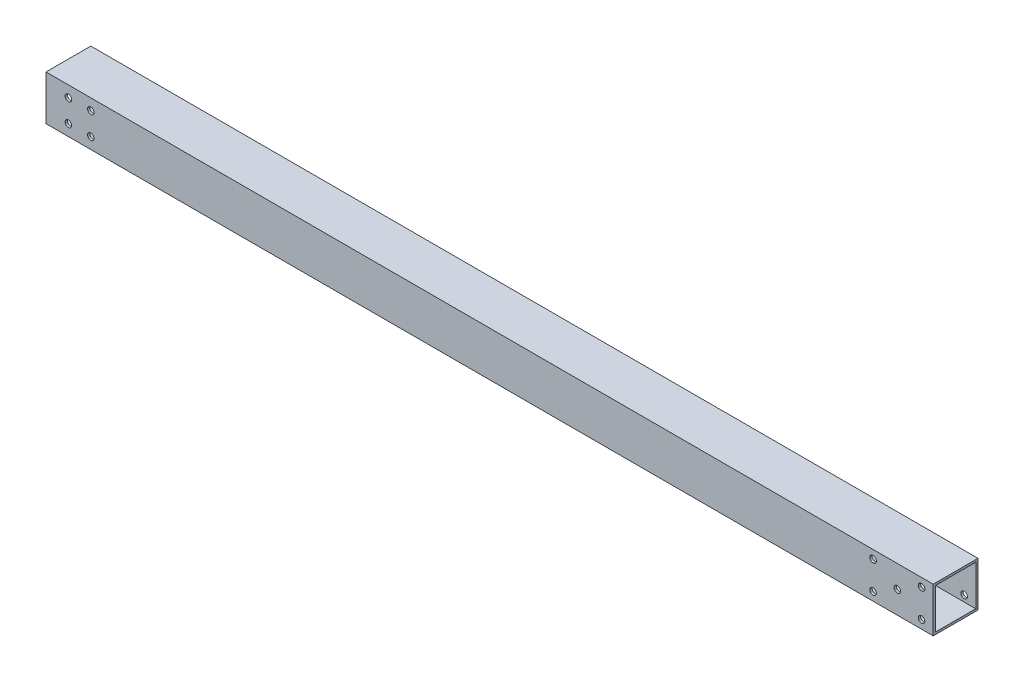
ISO-10303-21;
HEADER;
FILE_DESCRIPTION(('STEP AP214'),'2;1');
FILE_NAME('part.step','',(''),(''),'','','');
FILE_SCHEMA(('AUTOMOTIVE_DESIGN { 1 0 10303 214 1 1 1 1 }'));
ENDSEC;
DATA;
#1=APPLICATION_CONTEXT('core data for automotive mechanical design processes');
#2=APPLICATION_PROTOCOL_DEFINITION('international standard','automotive_design',2000,#1);
#3=PRODUCT_CONTEXT('',#1,'mechanical');
#4=PRODUCT('Part','Part','',(#3));
#5=PRODUCT_RELATED_PRODUCT_CATEGORY('part','',(#4));
#6=PRODUCT_DEFINITION_FORMATION('','',#4);
#7=PRODUCT_DEFINITION_CONTEXT('part definition',#1,'design');
#8=PRODUCT_DEFINITION('design','',#6,#7);
#9=PRODUCT_DEFINITION_SHAPE('','',#8);
#10=(LENGTH_UNIT() NAMED_UNIT(*) SI_UNIT(.MILLI.,.METRE.));
#11=(NAMED_UNIT(*) PLANE_ANGLE_UNIT() SI_UNIT($,.RADIAN.));
#12=(NAMED_UNIT(*) SI_UNIT($,.STERADIAN.) SOLID_ANGLE_UNIT());
#13=UNCERTAINTY_MEASURE_WITH_UNIT(LENGTH_MEASURE(1.E-05),#10,'distance_accuracy_value','');
#14=(GEOMETRIC_REPRESENTATION_CONTEXT(3) GLOBAL_UNCERTAINTY_ASSIGNED_CONTEXT((#13)) GLOBAL_UNIT_ASSIGNED_CONTEXT((#10,
#11,#12)) REPRESENTATION_CONTEXT('',''));
#15=CARTESIAN_POINT('',(0.,0.,0.));
#16=DIRECTION('',(0.,0.,1.));
#17=DIRECTION('',(1.,0.,0.));
#18=AXIS2_PLACEMENT_3D('',#15,#16,#17);
#19=CARTESIAN_POINT('',(396.,0.,0.));
#20=DIRECTION('',(1.,0.,0.));
#21=DIRECTION('',(0.,0.,-1.));
#22=AXIS2_PLACEMENT_3D('',#19,#20,#21);
#23=PLANE('',#22);
#24=DIRECTION('',(0.,1.,0.));
#25=VECTOR('',#24,1.);
#26=CARTESIAN_POINT('',(396.,9.99999999999999,-10.));
#27=LINE('',#26,#25);
#28=CARTESIAN_POINT('',(396.,-10.,-10.));
#29=VERTEX_POINT('',#28);
#30=CARTESIAN_POINT('',(396.,9.99999999999999,-10.));
#31=VERTEX_POINT('',#30);
#32=EDGE_CURVE('E146',#29,#31,#27,.T.);
#33=ORIENTED_EDGE('',*,*,#32,.T.);
#34=DIRECTION('',(0.,0.,1.));
#35=VECTOR('',#34,1.);
#36=CARTESIAN_POINT('',(396.,9.99999999999999,10.));
#37=LINE('',#36,#35);
#38=CARTESIAN_POINT('',(396.,9.99999999999999,10.));
#39=VERTEX_POINT('',#38);
#40=EDGE_CURVE('E149',#31,#39,#37,.T.);
#41=ORIENTED_EDGE('',*,*,#40,.T.);
#42=DIRECTION('',(0.,-1.,0.));
#43=VECTOR('',#42,1.);
#44=CARTESIAN_POINT('',(396.,9.99999999999999,10.));
#45=LINE('',#44,#43);
#46=CARTESIAN_POINT('',(396.,-10.,10.));
#47=VERTEX_POINT('',#46);
#48=EDGE_CURVE('E152',#39,#47,#45,.T.);
#49=ORIENTED_EDGE('',*,*,#48,.T.);
#50=DIRECTION('',(0.,0.,-1.));
#51=VECTOR('',#50,1.);
#52=CARTESIAN_POINT('',(396.,-10.,10.));
#53=LINE('',#52,#51);
#54=EDGE_CURVE('E154',#47,#29,#53,.T.);
#55=ORIENTED_EDGE('',*,*,#54,.T.);
#56=EDGE_LOOP('',(#33,#41,#49,#55));
#57=FACE_BOUND('',#56,.T.);
#58=DIRECTION('',(0.,0.,1.));
#59=VECTOR('',#58,1.);
#60=CARTESIAN_POINT('',(396.,9.,9.));
#61=LINE('',#60,#59);
#62=CARTESIAN_POINT('',(396.,9.,-9.));
#63=VERTEX_POINT('',#62);
#64=CARTESIAN_POINT('',(396.,9.,9.));
#65=VERTEX_POINT('',#64);
#66=EDGE_CURVE('E116',#63,#65,#61,.T.);
#67=ORIENTED_EDGE('',*,*,#66,.F.);
#68=DIRECTION('',(0.,1.,0.));
#69=VECTOR('',#68,1.);
#70=CARTESIAN_POINT('',(396.,9.,-9.));
#71=LINE('',#70,#69);
#72=CARTESIAN_POINT('',(396.,-9.,-9.));
#73=VERTEX_POINT('',#72);
#74=EDGE_CURVE('E108',#73,#63,#71,.T.);
#75=ORIENTED_EDGE('',*,*,#74,.F.);
#76=DIRECTION('',(0.,0.,-1.));
#77=VECTOR('',#76,1.);
#78=CARTESIAN_POINT('',(396.,-9.,9.));
#79=LINE('',#78,#77);
#80=CARTESIAN_POINT('',(396.,-9.,9.));
#81=VERTEX_POINT('',#80);
#82=EDGE_CURVE('E130',#81,#73,#79,.T.);
#83=ORIENTED_EDGE('',*,*,#82,.F.);
#84=DIRECTION('',(0.,-1.,0.));
#85=VECTOR('',#84,1.);
#86=CARTESIAN_POINT('',(396.,9.,9.));
#87=LINE('',#86,#85);
#88=EDGE_CURVE('E128',#65,#81,#87,.T.);
#89=ORIENTED_EDGE('',*,*,#88,.F.);
#90=EDGE_LOOP('',(#67,#75,#83,#89));
#91=FACE_BOUND('',#90,.T.);
#92=ADVANCED_FACE('F41',(#57,#91),#23,.T.);
#93=CARTESIAN_POINT('',(0.,0.,0.));
#94=DIRECTION('',(1.,0.,0.));
#95=DIRECTION('',(0.,0.,-1.));
#96=AXIS2_PLACEMENT_3D('',#93,#94,#95);
#97=PLANE('',#96);
#98=DIRECTION('',(0.,1.,0.));
#99=VECTOR('',#98,1.);
#100=CARTESIAN_POINT('',(0.,9.99999999999999,-10.));
#101=LINE('',#100,#99);
#102=CARTESIAN_POINT('',(0.,-10.,-10.));
#103=VERTEX_POINT('',#102);
#104=CARTESIAN_POINT('',(0.,9.99999999999999,-10.));
#105=VERTEX_POINT('',#104);
#106=EDGE_CURVE('E124',#103,#105,#101,.T.);
#107=ORIENTED_EDGE('',*,*,#106,.F.);
#108=DIRECTION('',(0.,0.,-1.));
#109=VECTOR('',#108,1.);
#110=CARTESIAN_POINT('',(0.,-10.,10.));
#111=LINE('',#110,#109);
#112=CARTESIAN_POINT('',(0.,-10.,10.));
#113=VERTEX_POINT('',#112);
#114=EDGE_CURVE('E150',#113,#103,#111,.T.);
#115=ORIENTED_EDGE('',*,*,#114,.F.);
#116=DIRECTION('',(0.,-1.,0.));
#117=VECTOR('',#116,1.);
#118=CARTESIAN_POINT('',(0.,9.99999999999999,10.));
#119=LINE('',#118,#117);
#120=CARTESIAN_POINT('',(0.,9.99999999999999,10.));
#121=VERTEX_POINT('',#120);
#122=EDGE_CURVE('E161',#121,#113,#119,.T.);
#123=ORIENTED_EDGE('',*,*,#122,.F.);
#124=DIRECTION('',(0.,0.,1.));
#125=VECTOR('',#124,1.);
#126=CARTESIAN_POINT('',(0.,9.99999999999999,10.));
#127=LINE('',#126,#125);
#128=EDGE_CURVE('E159',#105,#121,#127,.T.);
#129=ORIENTED_EDGE('',*,*,#128,.F.);
#130=EDGE_LOOP('',(#107,#115,#123,#129));
#131=FACE_BOUND('',#130,.T.);
#132=DIRECTION('',(0.,1.,0.));
#133=VECTOR('',#132,1.);
#134=CARTESIAN_POINT('',(0.,9.,-9.));
#135=LINE('',#134,#133);
#136=CARTESIAN_POINT('',(0.,-9.,-9.));
#137=VERTEX_POINT('',#136);
#138=CARTESIAN_POINT('',(0.,9.,-9.));
#139=VERTEX_POINT('',#138);
#140=EDGE_CURVE('E66',#137,#139,#135,.T.);
#141=ORIENTED_EDGE('',*,*,#140,.T.);
#142=DIRECTION('',(0.,0.,1.));
#143=VECTOR('',#142,1.);
#144=CARTESIAN_POINT('',(0.,9.,9.));
#145=LINE('',#144,#143);
#146=CARTESIAN_POINT('',(0.,9.,9.));
#147=VERTEX_POINT('',#146);
#148=EDGE_CURVE('E123',#139,#147,#145,.T.);
#149=ORIENTED_EDGE('',*,*,#148,.T.);
#150=DIRECTION('',(0.,-1.,0.));
#151=VECTOR('',#150,1.);
#152=CARTESIAN_POINT('',(0.,9.,9.));
#153=LINE('',#152,#151);
#154=CARTESIAN_POINT('',(0.,-9.,9.));
#155=VERTEX_POINT('',#154);
#156=EDGE_CURVE('E138',#147,#155,#153,.T.);
#157=ORIENTED_EDGE('',*,*,#156,.T.);
#158=DIRECTION('',(0.,0.,-1.));
#159=VECTOR('',#158,1.);
#160=CARTESIAN_POINT('',(0.,-9.,9.));
#161=LINE('',#160,#159);
#162=EDGE_CURVE('E117',#155,#137,#161,.T.);
#163=ORIENTED_EDGE('',*,*,#162,.T.);
#164=EDGE_LOOP('',(#141,#149,#157,#163));
#165=FACE_BOUND('',#164,.T.);
#166=ADVANCED_FACE('F283',(#131,#165),#97,.F.);
#167=CARTESIAN_POINT('',(396.,9.99999999999999,-10.));
#168=DIRECTION('',(0.,0.,1.));
#169=DIRECTION('',(0.,-1.,0.));
#170=AXIS2_PLACEMENT_3D('',#167,#168,#169);
#171=PLANE('',#170);
#172=CARTESIAN_POINT('',(20.0000000000001,-5.0000000000001,-10.));
#173=DIRECTION('',(0.,0.,1.));
#174=DIRECTION('',(1.,0.,0.));
#175=AXIS2_PLACEMENT_3D('',#172,#173,#174);
#176=CIRCLE('',#175,1.45);
#177=CARTESIAN_POINT('',(21.4500000000001,-5.0000000000001,-10.));
#178=VERTEX_POINT('',#177);
#179=EDGE_CURVE('E381',#178,#178,#176,.T.);
#180=ORIENTED_EDGE('',*,*,#179,.T.);
#181=EDGE_LOOP('',(#180));
#182=FACE_BOUND('',#181,.T.);
#183=CARTESIAN_POINT('',(10.0000000000001,-5.0000000000001,-10.));
#184=DIRECTION('',(0.,0.,1.));
#185=DIRECTION('',(1.,0.,0.));
#186=AXIS2_PLACEMENT_3D('',#183,#184,#185);
#187=CIRCLE('',#186,1.45);
#188=CARTESIAN_POINT('',(11.4500000000001,-5.0000000000001,-10.));
#189=VERTEX_POINT('',#188);
#190=EDGE_CURVE('E385',#189,#189,#187,.T.);
#191=ORIENTED_EDGE('',*,*,#190,.T.);
#192=EDGE_LOOP('',(#191));
#193=FACE_BOUND('',#192,.T.);
#194=CARTESIAN_POINT('',(20.0000000000001,4.9999999999999,-10.));
#195=DIRECTION('',(0.,0.,1.));
#196=DIRECTION('',(1.,0.,0.));
#197=AXIS2_PLACEMENT_3D('',#194,#195,#196);
#198=CIRCLE('',#197,1.45);
#199=CARTESIAN_POINT('',(21.4500000000001,4.9999999999999,-10.));
#200=VERTEX_POINT('',#199);
#201=EDGE_CURVE('E392',#200,#200,#198,.T.);
#202=ORIENTED_EDGE('',*,*,#201,.T.);
#203=EDGE_LOOP('',(#202));
#204=FACE_BOUND('',#203,.T.);
#205=CARTESIAN_POINT('',(10.0000000000001,4.9999999999999,-10.));
#206=DIRECTION('',(0.,0.,1.));
#207=DIRECTION('',(1.,0.,0.));
#208=AXIS2_PLACEMENT_3D('',#205,#206,#207);
#209=CIRCLE('',#208,1.45);
#210=CARTESIAN_POINT('',(11.4500000000001,4.9999999999999,-10.));
#211=VERTEX_POINT('',#210);
#212=EDGE_CURVE('E195',#211,#211,#209,.T.);
#213=ORIENTED_EDGE('',*,*,#212,.T.);
#214=EDGE_LOOP('',(#213));
#215=FACE_BOUND('',#214,.T.);
#216=CARTESIAN_POINT('',(380.,0.,-10.));
#217=DIRECTION('',(0.,0.,-1.));
#218=DIRECTION('',(0.,1.,0.));
#219=AXIS2_PLACEMENT_3D('',#216,#217,#218);
#220=CIRCLE('',#219,1.45);
#221=CARTESIAN_POINT('',(380.,1.45000000000001,-10.));
#222=VERTEX_POINT('',#221);
#223=EDGE_CURVE('E175',#222,#222,#220,.T.);
#224=ORIENTED_EDGE('',*,*,#223,.F.);
#225=EDGE_LOOP('',(#224));
#226=FACE_BOUND('',#225,.T.);
#227=CARTESIAN_POINT('',(390.825317547305,-6.25000000000003,-10.));
#228=DIRECTION('',(0.,0.,-1.));
#229=DIRECTION('',(0.,1.,0.));
#230=AXIS2_PLACEMENT_3D('',#227,#228,#229);
#231=CIRCLE('',#230,1.45);
#232=CARTESIAN_POINT('',(390.825317547305,-4.80000000000003,-10.));
#233=VERTEX_POINT('',#232);
#234=EDGE_CURVE('E222',#233,#233,#231,.T.);
#235=ORIENTED_EDGE('',*,*,#234,.F.);
#236=EDGE_LOOP('',(#235));
#237=FACE_BOUND('',#236,.T.);
#238=CARTESIAN_POINT('',(390.825317547305,6.24999999999998,-10.));
#239=DIRECTION('',(0.,0.,-1.));
#240=DIRECTION('',(0.,1.,0.));
#241=AXIS2_PLACEMENT_3D('',#238,#239,#240);
#242=CIRCLE('',#241,1.45);
#243=CARTESIAN_POINT('',(390.825317547305,7.69999999999998,-10.));
#244=VERTEX_POINT('',#243);
#245=EDGE_CURVE('E228',#244,#244,#242,.T.);
#246=ORIENTED_EDGE('',*,*,#245,.F.);
#247=EDGE_LOOP('',(#246));
#248=FACE_BOUND('',#247,.T.);
#249=CARTESIAN_POINT('',(369.174682452694,6.25000000000009,-10.));
#250=DIRECTION('',(0.,0.,-1.));
#251=DIRECTION('',(0.,1.,0.));
#252=AXIS2_PLACEMENT_3D('',#249,#250,#251);
#253=CIRCLE('',#252,1.45);
#254=CARTESIAN_POINT('',(369.174682452694,7.70000000000009,-10.));
#255=VERTEX_POINT('',#254);
#256=EDGE_CURVE('E234',#255,#255,#253,.T.);
#257=ORIENTED_EDGE('',*,*,#256,.F.);
#258=EDGE_LOOP('',(#257));
#259=FACE_BOUND('',#258,.T.);
#260=CARTESIAN_POINT('',(369.174682452694,-6.24999999999998,-10.));
#261=DIRECTION('',(0.,0.,-1.));
#262=DIRECTION('',(0.,1.,0.));
#263=AXIS2_PLACEMENT_3D('',#260,#261,#262);
#264=CIRCLE('',#263,1.45);
#265=CARTESIAN_POINT('',(369.174682452694,-4.79999999999997,-10.));
#266=VERTEX_POINT('',#265);
#267=EDGE_CURVE('E240',#266,#266,#264,.T.);
#268=ORIENTED_EDGE('',*,*,#267,.F.);
#269=EDGE_LOOP('',(#268));
#270=FACE_BOUND('',#269,.T.);
#271=ORIENTED_EDGE('',*,*,#106,.T.);
#272=DIRECTION('',(-1.,0.,0.));
#273=VECTOR('',#272,1.);
#274=CARTESIAN_POINT('',(396.,9.99999999999999,-10.));
#275=LINE('',#274,#273);
#276=EDGE_CURVE('E11',#31,#105,#275,.T.);
#277=ORIENTED_EDGE('',*,*,#276,.F.);
#278=ORIENTED_EDGE('',*,*,#32,.F.);
#279=DIRECTION('',(-1.,0.,0.));
#280=VECTOR('',#279,1.);
#281=CARTESIAN_POINT('',(396.,-10.,-10.));
#282=LINE('',#281,#280);
#283=EDGE_CURVE('E156',#29,#103,#282,.T.);
#284=ORIENTED_EDGE('',*,*,#283,.T.);
#285=EDGE_LOOP('',(#271,#277,#278,#284));
#286=FACE_BOUND('',#285,.T.);
#287=ADVANCED_FACE('F43',(#182,#193,#204,#215,#226,#237,#248,#259,#270,#286),#171,.F.);
#288=CARTESIAN_POINT('',(396.,9.99999999999999,10.));
#289=DIRECTION('',(0.,-1.,0.));
#290=DIRECTION('',(0.,0.,-1.));
#291=AXIS2_PLACEMENT_3D('',#288,#289,#290);
#292=PLANE('',#291);
#293=ORIENTED_EDGE('',*,*,#128,.T.);
#294=DIRECTION('',(-1.,0.,0.));
#295=VECTOR('',#294,1.);
#296=CARTESIAN_POINT('',(396.,9.99999999999999,10.));
#297=LINE('',#296,#295);
#298=EDGE_CURVE('E50',#39,#121,#297,.T.);
#299=ORIENTED_EDGE('',*,*,#298,.F.);
#300=ORIENTED_EDGE('',*,*,#40,.F.);
#301=ORIENTED_EDGE('',*,*,#276,.T.);
#302=EDGE_LOOP('',(#293,#299,#300,#301));
#303=FACE_BOUND('',#302,.T.);
#304=ADVANCED_FACE('F282',(#303),#292,.F.);
#305=CARTESIAN_POINT('',(396.,9.99999999999999,10.));
#306=DIRECTION('',(0.,0.,-1.));
#307=DIRECTION('',(-1.,0.,0.));
#308=AXIS2_PLACEMENT_3D('',#305,#306,#307);
#309=PLANE('',#308);
#310=CARTESIAN_POINT('',(20.0000000000001,-5.0000000000001,10.));
#311=DIRECTION('',(0.,0.,1.));
#312=DIRECTION('',(1.,0.,0.));
#313=AXIS2_PLACEMENT_3D('',#310,#311,#312);
#314=CIRCLE('',#313,1.45);
#315=CARTESIAN_POINT('',(21.4500000000001,-5.0000000000001,10.));
#316=VERTEX_POINT('',#315);
#317=EDGE_CURVE('E382',#316,#316,#314,.T.);
#318=ORIENTED_EDGE('',*,*,#317,.F.);
#319=EDGE_LOOP('',(#318));
#320=FACE_BOUND('',#319,.T.);
#321=CARTESIAN_POINT('',(10.0000000000001,-5.0000000000001,10.));
#322=DIRECTION('',(0.,0.,1.));
#323=DIRECTION('',(1.,0.,0.));
#324=AXIS2_PLACEMENT_3D('',#321,#322,#323);
#325=CIRCLE('',#324,1.45);
#326=CARTESIAN_POINT('',(11.4500000000001,-5.0000000000001,10.));
#327=VERTEX_POINT('',#326);
#328=EDGE_CURVE('E395',#327,#327,#325,.T.);
#329=ORIENTED_EDGE('',*,*,#328,.F.);
#330=EDGE_LOOP('',(#329));
#331=FACE_BOUND('',#330,.T.);
#332=CARTESIAN_POINT('',(20.0000000000001,4.9999999999999,10.));
#333=DIRECTION('',(0.,0.,1.));
#334=DIRECTION('',(1.,0.,0.));
#335=AXIS2_PLACEMENT_3D('',#332,#333,#334);
#336=CIRCLE('',#335,1.45);
#337=CARTESIAN_POINT('',(21.4500000000001,4.9999999999999,10.));
#338=VERTEX_POINT('',#337);
#339=EDGE_CURVE('E388',#338,#338,#336,.T.);
#340=ORIENTED_EDGE('',*,*,#339,.F.);
#341=EDGE_LOOP('',(#340));
#342=FACE_BOUND('',#341,.T.);
#343=CARTESIAN_POINT('',(10.0000000000001,4.9999999999999,10.));
#344=DIRECTION('',(0.,0.,1.));
#345=DIRECTION('',(1.,0.,0.));
#346=AXIS2_PLACEMENT_3D('',#343,#344,#345);
#347=CIRCLE('',#346,1.45);
#348=CARTESIAN_POINT('',(11.4500000000001,4.9999999999999,10.));
#349=VERTEX_POINT('',#348);
#350=EDGE_CURVE('E391',#349,#349,#347,.T.);
#351=ORIENTED_EDGE('',*,*,#350,.F.);
#352=EDGE_LOOP('',(#351));
#353=FACE_BOUND('',#352,.T.);
#354=CARTESIAN_POINT('',(380.,0.,10.));
#355=DIRECTION('',(0.,0.,-1.));
#356=DIRECTION('',(0.,1.,0.));
#357=AXIS2_PLACEMENT_3D('',#354,#355,#356);
#358=CIRCLE('',#357,1.45);
#359=CARTESIAN_POINT('',(380.,1.45000000000001,10.));
#360=VERTEX_POINT('',#359);
#361=EDGE_CURVE('E219',#360,#360,#358,.T.);
#362=ORIENTED_EDGE('',*,*,#361,.T.);
#363=EDGE_LOOP('',(#362));
#364=FACE_BOUND('',#363,.T.);
#365=CARTESIAN_POINT('',(390.825317547305,-6.25000000000003,10.));
#366=DIRECTION('',(0.,0.,-1.));
#367=DIRECTION('',(0.,1.,0.));
#368=AXIS2_PLACEMENT_3D('',#365,#366,#367);
#369=CIRCLE('',#368,1.45);
#370=CARTESIAN_POINT('',(390.825317547305,-4.80000000000003,10.));
#371=VERTEX_POINT('',#370);
#372=EDGE_CURVE('E225',#371,#371,#369,.T.);
#373=ORIENTED_EDGE('',*,*,#372,.T.);
#374=EDGE_LOOP('',(#373));
#375=FACE_BOUND('',#374,.T.);
#376=CARTESIAN_POINT('',(390.825317547305,6.24999999999998,10.));
#377=DIRECTION('',(0.,0.,-1.));
#378=DIRECTION('',(0.,1.,0.));
#379=AXIS2_PLACEMENT_3D('',#376,#377,#378);
#380=CIRCLE('',#379,1.45);
#381=CARTESIAN_POINT('',(390.825317547305,7.69999999999998,10.));
#382=VERTEX_POINT('',#381);
#383=EDGE_CURVE('E231',#382,#382,#380,.T.);
#384=ORIENTED_EDGE('',*,*,#383,.T.);
#385=EDGE_LOOP('',(#384));
#386=FACE_BOUND('',#385,.T.);
#387=CARTESIAN_POINT('',(369.174682452694,6.25000000000009,10.));
#388=DIRECTION('',(0.,0.,-1.));
#389=DIRECTION('',(0.,1.,0.));
#390=AXIS2_PLACEMENT_3D('',#387,#388,#389);
#391=CIRCLE('',#390,1.45);
#392=CARTESIAN_POINT('',(369.174682452694,7.70000000000009,10.));
#393=VERTEX_POINT('',#392);
#394=EDGE_CURVE('E237',#393,#393,#391,.T.);
#395=ORIENTED_EDGE('',*,*,#394,.T.);
#396=EDGE_LOOP('',(#395));
#397=FACE_BOUND('',#396,.T.);
#398=CARTESIAN_POINT('',(369.174682452694,-6.24999999999998,10.));
#399=DIRECTION('',(0.,0.,-1.));
#400=DIRECTION('',(0.,1.,0.));
#401=AXIS2_PLACEMENT_3D('',#398,#399,#400);
#402=CIRCLE('',#401,1.45);
#403=CARTESIAN_POINT('',(369.174682452694,-4.79999999999998,10.));
#404=VERTEX_POINT('',#403);
#405=EDGE_CURVE('E216',#404,#404,#402,.T.);
#406=ORIENTED_EDGE('',*,*,#405,.T.);
#407=EDGE_LOOP('',(#406));
#408=FACE_BOUND('',#407,.T.);
#409=ORIENTED_EDGE('',*,*,#122,.T.);
#410=DIRECTION('',(-1.,0.,0.));
#411=VECTOR('',#410,1.);
#412=CARTESIAN_POINT('',(396.,-10.,10.));
#413=LINE('',#412,#411);
#414=EDGE_CURVE('E166',#47,#113,#413,.T.);
#415=ORIENTED_EDGE('',*,*,#414,.F.);
#416=ORIENTED_EDGE('',*,*,#48,.F.);
#417=ORIENTED_EDGE('',*,*,#298,.T.);
#418=EDGE_LOOP('',(#409,#415,#416,#417));
#419=FACE_BOUND('',#418,.T.);
#420=ADVANCED_FACE('F301',(#320,#331,#342,#353,#364,#375,#386,#397,#408,#419),#309,.F.);
#421=CARTESIAN_POINT('',(396.,-10.,10.));
#422=DIRECTION('',(0.,1.,0.));
#423=DIRECTION('',(0.,0.,1.));
#424=AXIS2_PLACEMENT_3D('',#421,#422,#423);
#425=PLANE('',#424);
#426=ORIENTED_EDGE('',*,*,#114,.T.);
#427=ORIENTED_EDGE('',*,*,#283,.F.);
#428=ORIENTED_EDGE('',*,*,#54,.F.);
#429=ORIENTED_EDGE('',*,*,#414,.T.);
#430=EDGE_LOOP('',(#426,#427,#428,#429));
#431=FACE_BOUND('',#430,.T.);
#432=ADVANCED_FACE('F260',(#431),#425,.F.);
#433=CARTESIAN_POINT('',(396.,9.,-9.));
#434=DIRECTION('',(0.,0.,1.));
#435=DIRECTION('',(0.,-1.,0.));
#436=AXIS2_PLACEMENT_3D('',#433,#434,#435);
#437=PLANE('',#436);
#438=CARTESIAN_POINT('',(20.0000000000001,-5.0000000000001,-9.));
#439=DIRECTION('',(0.,0.,1.));
#440=DIRECTION('',(0.,-1.,0.));
#441=AXIS2_PLACEMENT_3D('',#438,#439,#440);
#442=CIRCLE('',#441,1.45);
#443=CARTESIAN_POINT('',(20.0000000000001,-6.4500000000001,-9.));
#444=VERTEX_POINT('',#443);
#445=EDGE_CURVE('E213',#444,#444,#442,.T.);
#446=ORIENTED_EDGE('',*,*,#445,.F.);
#447=EDGE_LOOP('',(#446));
#448=FACE_BOUND('',#447,.T.);
#449=CARTESIAN_POINT('',(10.0000000000001,-5.0000000000001,-9.));
#450=DIRECTION('',(0.,0.,1.));
#451=DIRECTION('',(0.,-1.,0.));
#452=AXIS2_PLACEMENT_3D('',#449,#450,#451);
#453=CIRCLE('',#452,1.45);
#454=CARTESIAN_POINT('',(10.0000000000001,-6.4500000000001,-9.));
#455=VERTEX_POINT('',#454);
#456=EDGE_CURVE('E201',#455,#455,#453,.T.);
#457=ORIENTED_EDGE('',*,*,#456,.F.);
#458=EDGE_LOOP('',(#457));
#459=FACE_BOUND('',#458,.T.);
#460=CARTESIAN_POINT('',(20.0000000000001,4.9999999999999,-9.));
#461=DIRECTION('',(0.,0.,1.));
#462=DIRECTION('',(0.,-1.,0.));
#463=AXIS2_PLACEMENT_3D('',#460,#461,#462);
#464=CIRCLE('',#463,1.45);
#465=CARTESIAN_POINT('',(20.0000000000001,3.5499999999999,-9.));
#466=VERTEX_POINT('',#465);
#467=EDGE_CURVE('E198',#466,#466,#464,.T.);
#468=ORIENTED_EDGE('',*,*,#467,.F.);
#469=EDGE_LOOP('',(#468));
#470=FACE_BOUND('',#469,.T.);
#471=CARTESIAN_POINT('',(10.0000000000001,4.9999999999999,-9.));
#472=DIRECTION('',(0.,0.,1.));
#473=DIRECTION('',(0.,-1.,0.));
#474=AXIS2_PLACEMENT_3D('',#471,#472,#473);
#475=CIRCLE('',#474,1.45);
#476=CARTESIAN_POINT('',(10.0000000000001,3.5499999999999,-9.));
#477=VERTEX_POINT('',#476);
#478=EDGE_CURVE('E194',#477,#477,#475,.T.);
#479=ORIENTED_EDGE('',*,*,#478,.F.);
#480=EDGE_LOOP('',(#479));
#481=FACE_BOUND('',#480,.T.);
#482=CARTESIAN_POINT('',(380.,0.,-9.));
#483=DIRECTION('',(0.,0.,1.));
#484=DIRECTION('',(0.,-1.,0.));
#485=AXIS2_PLACEMENT_3D('',#482,#483,#484);
#486=CIRCLE('',#485,1.45);
#487=CARTESIAN_POINT('',(380.,-1.44999999999999,-9.));
#488=VERTEX_POINT('',#487);
#489=EDGE_CURVE('E136',#488,#488,#486,.T.);
#490=ORIENTED_EDGE('',*,*,#489,.F.);
#491=EDGE_LOOP('',(#490));
#492=FACE_BOUND('',#491,.T.);
#493=CARTESIAN_POINT('',(390.825317547305,-6.25000000000003,-9.));
#494=DIRECTION('',(0.,0.,1.));
#495=DIRECTION('',(0.,-1.,0.));
#496=AXIS2_PLACEMENT_3D('',#493,#494,#495);
#497=CIRCLE('',#496,1.45);
#498=CARTESIAN_POINT('',(390.825317547305,-7.70000000000003,-9.));
#499=VERTEX_POINT('',#498);
#500=EDGE_CURVE('E187',#499,#499,#497,.T.);
#501=ORIENTED_EDGE('',*,*,#500,.F.);
#502=EDGE_LOOP('',(#501));
#503=FACE_BOUND('',#502,.T.);
#504=CARTESIAN_POINT('',(390.825317547305,6.24999999999998,-9.));
#505=DIRECTION('',(0.,0.,1.));
#506=DIRECTION('',(0.,-1.,0.));
#507=AXIS2_PLACEMENT_3D('',#504,#505,#506);
#508=CIRCLE('',#507,1.45);
#509=CARTESIAN_POINT('',(390.825317547305,4.79999999999998,-9.));
#510=VERTEX_POINT('',#509);
#511=EDGE_CURVE('E183',#510,#510,#508,.T.);
#512=ORIENTED_EDGE('',*,*,#511,.F.);
#513=EDGE_LOOP('',(#512));
#514=FACE_BOUND('',#513,.T.);
#515=CARTESIAN_POINT('',(369.174682452694,6.25000000000009,-9.));
#516=DIRECTION('',(0.,0.,1.));
#517=DIRECTION('',(0.,-1.,0.));
#518=AXIS2_PLACEMENT_3D('',#515,#516,#517);
#519=CIRCLE('',#518,1.45);
#520=CARTESIAN_POINT('',(369.174682452694,4.80000000000009,-9.));
#521=VERTEX_POINT('',#520);
#522=EDGE_CURVE('E179',#521,#521,#519,.T.);
#523=ORIENTED_EDGE('',*,*,#522,.F.);
#524=EDGE_LOOP('',(#523));
#525=FACE_BOUND('',#524,.T.);
#526=CARTESIAN_POINT('',(369.174682452694,-6.24999999999998,-9.));
#527=DIRECTION('',(0.,0.,1.));
#528=DIRECTION('',(0.,-1.,0.));
#529=AXIS2_PLACEMENT_3D('',#526,#527,#528);
#530=CIRCLE('',#529,1.45);
#531=CARTESIAN_POINT('',(369.174682452694,-7.69999999999998,-9.));
#532=VERTEX_POINT('',#531);
#533=EDGE_CURVE('E174',#532,#532,#530,.T.);
#534=ORIENTED_EDGE('',*,*,#533,.F.);
#535=EDGE_LOOP('',(#534));
#536=FACE_BOUND('',#535,.T.);
#537=ORIENTED_EDGE('',*,*,#140,.F.);
#538=DIRECTION('',(-1.,0.,0.));
#539=VECTOR('',#538,1.);
#540=CARTESIAN_POINT('',(396.,-9.,-9.));
#541=LINE('',#540,#539);
#542=EDGE_CURVE('E112',#73,#137,#541,.T.);
#543=ORIENTED_EDGE('',*,*,#542,.F.);
#544=ORIENTED_EDGE('',*,*,#74,.T.);
#545=DIRECTION('',(-1.,0.,0.));
#546=VECTOR('',#545,1.);
#547=CARTESIAN_POINT('',(396.,9.,-9.));
#548=LINE('',#547,#546);
#549=EDGE_CURVE('E111',#63,#139,#548,.T.);
#550=ORIENTED_EDGE('',*,*,#549,.T.);
#551=EDGE_LOOP('',(#537,#543,#544,#550));
#552=FACE_BOUND('',#551,.T.);
#553=ADVANCED_FACE('F110',(#448,#459,#470,#481,#492,#503,#514,#525,#536,#552),#437,.T.);
#554=CARTESIAN_POINT('',(396.,9.,9.));
#555=DIRECTION('',(0.,-1.,0.));
#556=DIRECTION('',(0.,0.,-1.));
#557=AXIS2_PLACEMENT_3D('',#554,#555,#556);
#558=PLANE('',#557);
#559=ORIENTED_EDGE('',*,*,#148,.F.);
#560=ORIENTED_EDGE('',*,*,#549,.F.);
#561=ORIENTED_EDGE('',*,*,#66,.T.);
#562=DIRECTION('',(-1.,0.,0.));
#563=VECTOR('',#562,1.);
#564=CARTESIAN_POINT('',(396.,9.,9.));
#565=LINE('',#564,#563);
#566=EDGE_CURVE('E125',#65,#147,#565,.T.);
#567=ORIENTED_EDGE('',*,*,#566,.T.);
#568=EDGE_LOOP('',(#559,#560,#561,#567));
#569=FACE_BOUND('',#568,.T.);
#570=ADVANCED_FACE('F120',(#569),#558,.T.);
#571=CARTESIAN_POINT('',(396.,9.,9.));
#572=DIRECTION('',(0.,0.,-1.));
#573=DIRECTION('',(0.,1.,0.));
#574=AXIS2_PLACEMENT_3D('',#571,#572,#573);
#575=PLANE('',#574);
#576=CARTESIAN_POINT('',(20.0000000000001,-5.0000000000001,9.));
#577=DIRECTION('',(0.,0.,-1.));
#578=DIRECTION('',(0.,1.,0.));
#579=AXIS2_PLACEMENT_3D('',#576,#577,#578);
#580=CIRCLE('',#579,1.45);
#581=CARTESIAN_POINT('',(20.0000000000001,-3.5500000000001,9.));
#582=VERTEX_POINT('',#581);
#583=EDGE_CURVE('E45',#582,#582,#580,.T.);
#584=ORIENTED_EDGE('',*,*,#583,.F.);
#585=EDGE_LOOP('',(#584));
#586=FACE_BOUND('',#585,.T.);
#587=CARTESIAN_POINT('',(10.0000000000001,-5.0000000000001,9.));
#588=DIRECTION('',(0.,0.,-1.));
#589=DIRECTION('',(0.,1.,0.));
#590=AXIS2_PLACEMENT_3D('',#587,#588,#589);
#591=CIRCLE('',#590,1.45);
#592=CARTESIAN_POINT('',(10.0000000000001,-3.5500000000001,9.));
#593=VERTEX_POINT('',#592);
#594=EDGE_CURVE('E199',#593,#593,#591,.T.);
#595=ORIENTED_EDGE('',*,*,#594,.F.);
#596=EDGE_LOOP('',(#595));
#597=FACE_BOUND('',#596,.T.);
#598=CARTESIAN_POINT('',(20.0000000000001,4.9999999999999,9.));
#599=DIRECTION('',(0.,0.,-1.));
#600=DIRECTION('',(0.,1.,0.));
#601=AXIS2_PLACEMENT_3D('',#598,#599,#600);
#602=CIRCLE('',#601,1.45);
#603=CARTESIAN_POINT('',(20.0000000000001,6.4499999999999,9.));
#604=VERTEX_POINT('',#603);
#605=EDGE_CURVE('E196',#604,#604,#602,.T.);
#606=ORIENTED_EDGE('',*,*,#605,.F.);
#607=EDGE_LOOP('',(#606));
#608=FACE_BOUND('',#607,.T.);
#609=CARTESIAN_POINT('',(10.0000000000001,4.9999999999999,9.));
#610=DIRECTION('',(0.,0.,-1.));
#611=DIRECTION('',(0.,1.,0.));
#612=AXIS2_PLACEMENT_3D('',#609,#610,#611);
#613=CIRCLE('',#612,1.45);
#614=CARTESIAN_POINT('',(10.0000000000001,6.4499999999999,9.));
#615=VERTEX_POINT('',#614);
#616=EDGE_CURVE('E191',#615,#615,#613,.T.);
#617=ORIENTED_EDGE('',*,*,#616,.F.);
#618=EDGE_LOOP('',(#617));
#619=FACE_BOUND('',#618,.T.);
#620=CARTESIAN_POINT('',(380.,0.,9.));
#621=DIRECTION('',(0.,0.,-1.));
#622=DIRECTION('',(0.,1.,0.));
#623=AXIS2_PLACEMENT_3D('',#620,#621,#622);
#624=CIRCLE('',#623,1.45);
#625=CARTESIAN_POINT('',(380.,1.45000000000001,9.));
#626=VERTEX_POINT('',#625);
#627=EDGE_CURVE('E188',#626,#626,#624,.T.);
#628=ORIENTED_EDGE('',*,*,#627,.F.);
#629=EDGE_LOOP('',(#628));
#630=FACE_BOUND('',#629,.T.);
#631=CARTESIAN_POINT('',(390.825317547305,-6.25000000000003,9.));
#632=DIRECTION('',(0.,0.,-1.));
#633=DIRECTION('',(0.,1.,0.));
#634=AXIS2_PLACEMENT_3D('',#631,#632,#633);
#635=CIRCLE('',#634,1.45);
#636=CARTESIAN_POINT('',(390.825317547305,-4.80000000000003,9.));
#637=VERTEX_POINT('',#636);
#638=EDGE_CURVE('E184',#637,#637,#635,.T.);
#639=ORIENTED_EDGE('',*,*,#638,.F.);
#640=EDGE_LOOP('',(#639));
#641=FACE_BOUND('',#640,.T.);
#642=CARTESIAN_POINT('',(390.825317547305,6.24999999999998,9.));
#643=DIRECTION('',(0.,0.,-1.));
#644=DIRECTION('',(0.,1.,0.));
#645=AXIS2_PLACEMENT_3D('',#642,#643,#644);
#646=CIRCLE('',#645,1.45);
#647=CARTESIAN_POINT('',(390.825317547305,7.69999999999998,9.));
#648=VERTEX_POINT('',#647);
#649=EDGE_CURVE('E180',#648,#648,#646,.T.);
#650=ORIENTED_EDGE('',*,*,#649,.F.);
#651=EDGE_LOOP('',(#650));
#652=FACE_BOUND('',#651,.T.);
#653=CARTESIAN_POINT('',(369.174682452694,6.25000000000009,9.));
#654=DIRECTION('',(0.,0.,-1.));
#655=DIRECTION('',(0.,1.,0.));
#656=AXIS2_PLACEMENT_3D('',#653,#654,#655);
#657=CIRCLE('',#656,1.45);
#658=CARTESIAN_POINT('',(369.174682452694,7.70000000000009,9.));
#659=VERTEX_POINT('',#658);
#660=EDGE_CURVE('E176',#659,#659,#657,.T.);
#661=ORIENTED_EDGE('',*,*,#660,.F.);
#662=EDGE_LOOP('',(#661));
#663=FACE_BOUND('',#662,.T.);
#664=CARTESIAN_POINT('',(369.174682452694,-6.24999999999998,9.));
#665=DIRECTION('',(0.,0.,-1.));
#666=DIRECTION('',(0.,1.,0.));
#667=AXIS2_PLACEMENT_3D('',#664,#665,#666);
#668=CIRCLE('',#667,1.45);
#669=CARTESIAN_POINT('',(369.174682452694,-4.79999999999998,9.));
#670=VERTEX_POINT('',#669);
#671=EDGE_CURVE('E171',#670,#670,#668,.T.);
#672=ORIENTED_EDGE('',*,*,#671,.F.);
#673=EDGE_LOOP('',(#672));
#674=FACE_BOUND('',#673,.T.);
#675=ORIENTED_EDGE('',*,*,#156,.F.);
#676=ORIENTED_EDGE('',*,*,#566,.F.);
#677=ORIENTED_EDGE('',*,*,#88,.T.);
#678=DIRECTION('',(-1.,0.,0.));
#679=VECTOR('',#678,1.);
#680=CARTESIAN_POINT('',(396.,-9.,9.));
#681=LINE('',#680,#679);
#682=EDGE_CURVE('E58',#81,#155,#681,.T.);
#683=ORIENTED_EDGE('',*,*,#682,.T.);
#684=EDGE_LOOP('',(#675,#676,#677,#683));
#685=FACE_BOUND('',#684,.T.);
#686=ADVANCED_FACE('F321',(#586,#597,#608,#619,#630,#641,#652,#663,#674,#685),#575,.T.);
#687=CARTESIAN_POINT('',(396.,-9.,9.));
#688=DIRECTION('',(0.,1.,0.));
#689=DIRECTION('',(0.,0.,1.));
#690=AXIS2_PLACEMENT_3D('',#687,#688,#689);
#691=PLANE('',#690);
#692=ORIENTED_EDGE('',*,*,#162,.F.);
#693=ORIENTED_EDGE('',*,*,#682,.F.);
#694=ORIENTED_EDGE('',*,*,#82,.T.);
#695=ORIENTED_EDGE('',*,*,#542,.T.);
#696=EDGE_LOOP('',(#692,#693,#694,#695));
#697=FACE_BOUND('',#696,.T.);
#698=ADVANCED_FACE('F324',(#697),#691,.T.);
#699=CARTESIAN_POINT('',(369.174682452694,-6.24999999999998,10.));
#700=DIRECTION('',(0.,0.,-1.));
#701=DIRECTION('',(0.,1.,0.));
#702=AXIS2_PLACEMENT_3D('',#699,#700,#701);
#703=CYLINDRICAL_SURFACE('',#702,1.45);
#704=ORIENTED_EDGE('',*,*,#671,.T.);
#705=EDGE_LOOP('',(#704));
#706=FACE_BOUND('',#705,.T.);
#707=ORIENTED_EDGE('',*,*,#405,.F.);
#708=EDGE_LOOP('',(#707));
#709=FACE_BOUND('',#708,.T.);
#710=ADVANCED_FACE('F277',(#706,#709),#703,.F.);
#711=CARTESIAN_POINT('',(369.174682452694,6.25000000000009,10.));
#712=DIRECTION('',(0.,0.,-1.));
#713=DIRECTION('',(0.,1.,0.));
#714=AXIS2_PLACEMENT_3D('',#711,#712,#713);
#715=CYLINDRICAL_SURFACE('',#714,1.45);
#716=ORIENTED_EDGE('',*,*,#660,.T.);
#717=EDGE_LOOP('',(#716));
#718=FACE_BOUND('',#717,.T.);
#719=ORIENTED_EDGE('',*,*,#394,.F.);
#720=EDGE_LOOP('',(#719));
#721=FACE_BOUND('',#720,.T.);
#722=ADVANCED_FACE('F329',(#718,#721),#715,.F.);
#723=CARTESIAN_POINT('',(390.825317547305,6.24999999999998,10.));
#724=DIRECTION('',(0.,0.,-1.));
#725=DIRECTION('',(0.,1.,0.));
#726=AXIS2_PLACEMENT_3D('',#723,#724,#725);
#727=CYLINDRICAL_SURFACE('',#726,1.45);
#728=ORIENTED_EDGE('',*,*,#649,.T.);
#729=EDGE_LOOP('',(#728));
#730=FACE_BOUND('',#729,.T.);
#731=ORIENTED_EDGE('',*,*,#383,.F.);
#732=EDGE_LOOP('',(#731));
#733=FACE_BOUND('',#732,.T.);
#734=ADVANCED_FACE('F333',(#730,#733),#727,.F.);
#735=CARTESIAN_POINT('',(390.825317547305,-6.25000000000003,10.));
#736=DIRECTION('',(0.,0.,-1.));
#737=DIRECTION('',(0.,1.,0.));
#738=AXIS2_PLACEMENT_3D('',#735,#736,#737);
#739=CYLINDRICAL_SURFACE('',#738,1.45);
#740=ORIENTED_EDGE('',*,*,#638,.T.);
#741=EDGE_LOOP('',(#740));
#742=FACE_BOUND('',#741,.T.);
#743=ORIENTED_EDGE('',*,*,#372,.F.);
#744=EDGE_LOOP('',(#743));
#745=FACE_BOUND('',#744,.T.);
#746=ADVANCED_FACE('F337',(#742,#745),#739,.F.);
#747=CARTESIAN_POINT('',(380.,0.,10.));
#748=DIRECTION('',(0.,0.,-1.));
#749=DIRECTION('',(0.,1.,0.));
#750=AXIS2_PLACEMENT_3D('',#747,#748,#749);
#751=CYLINDRICAL_SURFACE('',#750,1.45);
#752=ORIENTED_EDGE('',*,*,#627,.T.);
#753=EDGE_LOOP('',(#752));
#754=FACE_BOUND('',#753,.T.);
#755=ORIENTED_EDGE('',*,*,#361,.F.);
#756=EDGE_LOOP('',(#755));
#757=FACE_BOUND('',#756,.T.);
#758=ADVANCED_FACE('F275',(#754,#757),#751,.F.);
#759=ORIENTED_EDGE('',*,*,#533,.T.);
#760=EDGE_LOOP('',(#759));
#761=FACE_BOUND('',#760,.T.);
#762=ORIENTED_EDGE('',*,*,#267,.T.);
#763=EDGE_LOOP('',(#762));
#764=FACE_BOUND('',#763,.T.);
#765=ADVANCED_FACE('F271',(#761,#764),#703,.F.);
#766=ORIENTED_EDGE('',*,*,#522,.T.);
#767=EDGE_LOOP('',(#766));
#768=FACE_BOUND('',#767,.T.);
#769=ORIENTED_EDGE('',*,*,#256,.T.);
#770=EDGE_LOOP('',(#769));
#771=FACE_BOUND('',#770,.T.);
#772=ADVANCED_FACE('F274',(#768,#771),#715,.F.);
#773=ORIENTED_EDGE('',*,*,#511,.T.);
#774=EDGE_LOOP('',(#773));
#775=FACE_BOUND('',#774,.T.);
#776=ORIENTED_EDGE('',*,*,#245,.T.);
#777=EDGE_LOOP('',(#776));
#778=FACE_BOUND('',#777,.T.);
#779=ADVANCED_FACE('F339',(#775,#778),#727,.F.);
#780=ORIENTED_EDGE('',*,*,#500,.T.);
#781=EDGE_LOOP('',(#780));
#782=FACE_BOUND('',#781,.T.);
#783=ORIENTED_EDGE('',*,*,#234,.T.);
#784=EDGE_LOOP('',(#783));
#785=FACE_BOUND('',#784,.T.);
#786=ADVANCED_FACE('F343',(#782,#785),#739,.F.);
#787=ORIENTED_EDGE('',*,*,#489,.T.);
#788=EDGE_LOOP('',(#787));
#789=FACE_BOUND('',#788,.T.);
#790=ORIENTED_EDGE('',*,*,#223,.T.);
#791=EDGE_LOOP('',(#790));
#792=FACE_BOUND('',#791,.T.);
#793=ADVANCED_FACE('F255',(#789,#792),#751,.F.);
#794=CARTESIAN_POINT('',(10.0000000000001,4.9999999999999,-10.));
#795=DIRECTION('',(0.,0.,1.));
#796=DIRECTION('',(1.,0.,0.));
#797=AXIS2_PLACEMENT_3D('',#794,#795,#796);
#798=CYLINDRICAL_SURFACE('',#797,1.45);
#799=ORIENTED_EDGE('',*,*,#616,.T.);
#800=EDGE_LOOP('',(#799));
#801=FACE_BOUND('',#800,.T.);
#802=ORIENTED_EDGE('',*,*,#350,.T.);
#803=EDGE_LOOP('',(#802));
#804=FACE_BOUND('',#803,.T.);
#805=ADVANCED_FACE('F347',(#801,#804),#798,.F.);
#806=CARTESIAN_POINT('',(20.0000000000001,4.9999999999999,-10.));
#807=DIRECTION('',(0.,0.,1.));
#808=DIRECTION('',(1.,0.,0.));
#809=AXIS2_PLACEMENT_3D('',#806,#807,#808);
#810=CYLINDRICAL_SURFACE('',#809,1.45);
#811=ORIENTED_EDGE('',*,*,#605,.T.);
#812=EDGE_LOOP('',(#811));
#813=FACE_BOUND('',#812,.T.);
#814=ORIENTED_EDGE('',*,*,#339,.T.);
#815=EDGE_LOOP('',(#814));
#816=FACE_BOUND('',#815,.T.);
#817=ADVANCED_FACE('F350',(#813,#816),#810,.F.);
#818=CARTESIAN_POINT('',(10.0000000000001,-5.0000000000001,-10.));
#819=DIRECTION('',(0.,0.,1.));
#820=DIRECTION('',(1.,0.,0.));
#821=AXIS2_PLACEMENT_3D('',#818,#819,#820);
#822=CYLINDRICAL_SURFACE('',#821,1.45);
#823=ORIENTED_EDGE('',*,*,#594,.T.);
#824=EDGE_LOOP('',(#823));
#825=FACE_BOUND('',#824,.T.);
#826=ORIENTED_EDGE('',*,*,#328,.T.);
#827=EDGE_LOOP('',(#826));
#828=FACE_BOUND('',#827,.T.);
#829=ADVANCED_FACE('F353',(#825,#828),#822,.F.);
#830=CARTESIAN_POINT('',(20.0000000000001,-5.0000000000001,-10.));
#831=DIRECTION('',(0.,0.,1.));
#832=DIRECTION('',(1.,0.,0.));
#833=AXIS2_PLACEMENT_3D('',#830,#831,#832);
#834=CYLINDRICAL_SURFACE('',#833,1.45);
#835=ORIENTED_EDGE('',*,*,#583,.T.);
#836=EDGE_LOOP('',(#835));
#837=FACE_BOUND('',#836,.T.);
#838=ORIENTED_EDGE('',*,*,#317,.T.);
#839=EDGE_LOOP('',(#838));
#840=FACE_BOUND('',#839,.T.);
#841=ADVANCED_FACE('F356',(#837,#840),#834,.F.);
#842=ORIENTED_EDGE('',*,*,#478,.T.);
#843=EDGE_LOOP('',(#842));
#844=FACE_BOUND('',#843,.T.);
#845=ORIENTED_EDGE('',*,*,#212,.F.);
#846=EDGE_LOOP('',(#845));
#847=FACE_BOUND('',#846,.T.);
#848=ADVANCED_FACE('F352',(#844,#847),#798,.F.);
#849=ORIENTED_EDGE('',*,*,#467,.T.);
#850=EDGE_LOOP('',(#849));
#851=FACE_BOUND('',#850,.T.);
#852=ORIENTED_EDGE('',*,*,#201,.F.);
#853=EDGE_LOOP('',(#852));
#854=FACE_BOUND('',#853,.T.);
#855=ADVANCED_FACE('F361',(#851,#854),#810,.F.);
#856=ORIENTED_EDGE('',*,*,#456,.T.);
#857=EDGE_LOOP('',(#856));
#858=FACE_BOUND('',#857,.T.);
#859=ORIENTED_EDGE('',*,*,#190,.F.);
#860=EDGE_LOOP('',(#859));
#861=FACE_BOUND('',#860,.T.);
#862=ADVANCED_FACE('F357',(#858,#861),#822,.F.);
#863=ORIENTED_EDGE('',*,*,#445,.T.);
#864=EDGE_LOOP('',(#863));
#865=FACE_BOUND('',#864,.T.);
#866=ORIENTED_EDGE('',*,*,#179,.F.);
#867=EDGE_LOOP('',(#866));
#868=FACE_BOUND('',#867,.T.);
#869=ADVANCED_FACE('F364',(#865,#868),#834,.F.);
#870=CLOSED_SHELL('',(#92,#166,#287,#304,#420,#432,#553,#570,#686,#698,#710,#722,#734,#746,#758,
#765,#772,#779,#786,#793,#805,#817,#829,#841,#848,#855,#862,#869));
#871=MANIFOLD_SOLID_BREP('B2',#870);
#872=ADVANCED_BREP_SHAPE_REPRESENTATION('',(#18,#871),#14);
#873=SHAPE_DEFINITION_REPRESENTATION(#9,#872);
ENDSEC;
END-ISO-10303-21;
